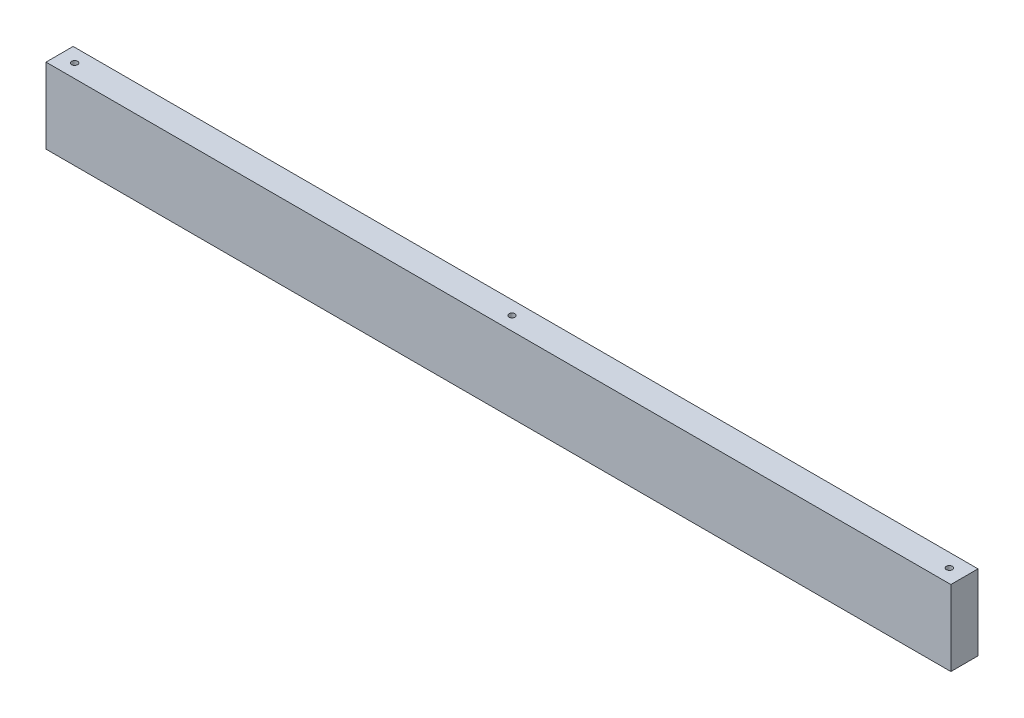
ISO-10303-21;
HEADER;
FILE_DESCRIPTION(('STEP AP214'),'2;1');
FILE_NAME('part.step','',(''),(''),'','','');
FILE_SCHEMA(('AUTOMOTIVE_DESIGN { 1 0 10303 214 1 1 1 1 }'));
ENDSEC;
DATA;
#1=APPLICATION_CONTEXT('core data for automotive mechanical design processes');
#2=APPLICATION_PROTOCOL_DEFINITION('international standard','automotive_design',2000,#1);
#3=PRODUCT_CONTEXT('',#1,'mechanical');
#4=PRODUCT('Part','Part','',(#3));
#5=PRODUCT_RELATED_PRODUCT_CATEGORY('part','',(#4));
#6=PRODUCT_DEFINITION_FORMATION('','',#4);
#7=PRODUCT_DEFINITION_CONTEXT('part definition',#1,'design');
#8=PRODUCT_DEFINITION('design','',#6,#7);
#9=PRODUCT_DEFINITION_SHAPE('','',#8);
#10=(LENGTH_UNIT() NAMED_UNIT(*) SI_UNIT(.MILLI.,.METRE.));
#11=(NAMED_UNIT(*) PLANE_ANGLE_UNIT() SI_UNIT($,.RADIAN.));
#12=(NAMED_UNIT(*) SI_UNIT($,.STERADIAN.) SOLID_ANGLE_UNIT());
#13=UNCERTAINTY_MEASURE_WITH_UNIT(LENGTH_MEASURE(1.E-05),#10,'distance_accuracy_value','');
#14=(GEOMETRIC_REPRESENTATION_CONTEXT(3) GLOBAL_UNCERTAINTY_ASSIGNED_CONTEXT((#13)) GLOBAL_UNIT_ASSIGNED_CONTEXT((#10,
#11,#12)) REPRESENTATION_CONTEXT('',''));
#15=CARTESIAN_POINT('',(0.,0.,0.));
#16=DIRECTION('',(0.,0.,1.));
#17=DIRECTION('',(1.,0.,0.));
#18=AXIS2_PLACEMENT_3D('',#15,#16,#17);
#19=CARTESIAN_POINT('',(300.,-25.,18.));
#20=DIRECTION('',(-1.,0.,0.));
#21=DIRECTION('',(0.,0.,1.));
#22=AXIS2_PLACEMENT_3D('',#19,#20,#21);
#23=PLANE('',#22);
#24=DIRECTION('',(0.,1.,0.));
#25=VECTOR('',#24,1.);
#26=CARTESIAN_POINT('',(300.,-25.,0.));
#27=LINE('',#26,#25);
#28=CARTESIAN_POINT('',(300.,-25.,0.));
#29=VERTEX_POINT('',#28);
#30=CARTESIAN_POINT('',(300.,25.,0.));
#31=VERTEX_POINT('',#30);
#32=EDGE_CURVE('E106',#29,#31,#27,.T.);
#33=ORIENTED_EDGE('',*,*,#32,.T.);
#34=DIRECTION('',(0.,0.,-1.));
#35=VECTOR('',#34,1.);
#36=CARTESIAN_POINT('',(300.,25.,18.));
#37=LINE('',#36,#35);
#38=CARTESIAN_POINT('',(300.,25.,18.));
#39=VERTEX_POINT('',#38);
#40=EDGE_CURVE('E11',#39,#31,#37,.T.);
#41=ORIENTED_EDGE('',*,*,#40,.F.);
#42=DIRECTION('',(0.,1.,0.));
#43=VECTOR('',#42,1.);
#44=CARTESIAN_POINT('',(300.,-25.,18.));
#45=LINE('',#44,#43);
#46=CARTESIAN_POINT('',(300.,-25.,18.));
#47=VERTEX_POINT('',#46);
#48=EDGE_CURVE('E94',#47,#39,#45,.T.);
#49=ORIENTED_EDGE('',*,*,#48,.F.);
#50=DIRECTION('',(0.,0.,-1.));
#51=VECTOR('',#50,1.);
#52=CARTESIAN_POINT('',(300.,-25.,18.));
#53=LINE('',#52,#51);
#54=EDGE_CURVE('E102',#47,#29,#53,.T.);
#55=ORIENTED_EDGE('',*,*,#54,.T.);
#56=EDGE_LOOP('',(#33,#41,#49,#55));
#57=FACE_BOUND('',#56,.T.);
#58=ADVANCED_FACE('F43',(#57),#23,.F.);
#59=CARTESIAN_POINT('',(-300.,25.,18.));
#60=DIRECTION('',(0.,-1.,0.));
#61=DIRECTION('',(0.,0.,-1.));
#62=AXIS2_PLACEMENT_3D('',#59,#60,#61);
#63=PLANE('',#62);
#64=CARTESIAN_POINT('',(-290.,25.,9.));
#65=DIRECTION('',(0.,1.,0.));
#66=DIRECTION('',(0.,0.,1.));
#67=AXIS2_PLACEMENT_3D('',#64,#65,#66);
#68=CIRCLE('',#67,2.);
#69=CARTESIAN_POINT('',(-290.,25.,11.));
#70=VERTEX_POINT('',#69);
#71=EDGE_CURVE('E132',#70,#70,#68,.T.);
#72=ORIENTED_EDGE('',*,*,#71,.F.);
#73=EDGE_LOOP('',(#72));
#74=FACE_BOUND('',#73,.T.);
#75=CARTESIAN_POINT('',(0.,25.,9.));
#76=DIRECTION('',(0.,1.,0.));
#77=DIRECTION('',(0.,0.,1.));
#78=AXIS2_PLACEMENT_3D('',#75,#76,#77);
#79=CIRCLE('',#78,2.);
#80=CARTESIAN_POINT('',(0.,25.,11.));
#81=VERTEX_POINT('',#80);
#82=EDGE_CURVE('E126',#81,#81,#79,.T.);
#83=ORIENTED_EDGE('',*,*,#82,.F.);
#84=EDGE_LOOP('',(#83));
#85=FACE_BOUND('',#84,.T.);
#86=CARTESIAN_POINT('',(290.,25.,9.));
#87=DIRECTION('',(0.,1.,0.));
#88=DIRECTION('',(0.,0.,1.));
#89=AXIS2_PLACEMENT_3D('',#86,#87,#88);
#90=CIRCLE('',#89,2.);
#91=CARTESIAN_POINT('',(290.,25.,11.));
#92=VERTEX_POINT('',#91);
#93=EDGE_CURVE('E120',#92,#92,#90,.T.);
#94=ORIENTED_EDGE('',*,*,#93,.F.);
#95=EDGE_LOOP('',(#94));
#96=FACE_BOUND('',#95,.T.);
#97=DIRECTION('',(-1.,0.,0.));
#98=VECTOR('',#97,1.);
#99=CARTESIAN_POINT('',(-300.,25.,0.));
#100=LINE('',#99,#98);
#101=CARTESIAN_POINT('',(-300.,25.,0.));
#102=VERTEX_POINT('',#101);
#103=EDGE_CURVE('E98',#31,#102,#100,.T.);
#104=ORIENTED_EDGE('',*,*,#103,.T.);
#105=DIRECTION('',(0.,0.,-1.));
#106=VECTOR('',#105,1.);
#107=CARTESIAN_POINT('',(-300.,25.,18.));
#108=LINE('',#107,#106);
#109=CARTESIAN_POINT('',(-300.,25.,18.));
#110=VERTEX_POINT('',#109);
#111=EDGE_CURVE('E51',#110,#102,#108,.T.);
#112=ORIENTED_EDGE('',*,*,#111,.F.);
#113=DIRECTION('',(-1.,0.,0.));
#114=VECTOR('',#113,1.);
#115=CARTESIAN_POINT('',(-300.,25.,18.));
#116=LINE('',#115,#114);
#117=EDGE_CURVE('E89',#39,#110,#116,.T.);
#118=ORIENTED_EDGE('',*,*,#117,.F.);
#119=ORIENTED_EDGE('',*,*,#40,.T.);
#120=EDGE_LOOP('',(#104,#112,#118,#119));
#121=FACE_BOUND('',#120,.T.);
#122=ADVANCED_FACE('F97',(#74,#85,#96,#121),#63,.F.);
#123=CARTESIAN_POINT('',(-300.,-25.,18.));
#124=DIRECTION('',(1.,0.,0.));
#125=DIRECTION('',(0.,0.,-1.));
#126=AXIS2_PLACEMENT_3D('',#123,#124,#125);
#127=PLANE('',#126);
#128=DIRECTION('',(0.,-1.,0.));
#129=VECTOR('',#128,1.);
#130=CARTESIAN_POINT('',(-300.,-25.,0.));
#131=LINE('',#130,#129);
#132=CARTESIAN_POINT('',(-300.,-25.,0.));
#133=VERTEX_POINT('',#132);
#134=EDGE_CURVE('E76',#102,#133,#131,.T.);
#135=ORIENTED_EDGE('',*,*,#134,.T.);
#136=DIRECTION('',(0.,0.,-1.));
#137=VECTOR('',#136,1.);
#138=CARTESIAN_POINT('',(-300.,-25.,18.));
#139=LINE('',#138,#137);
#140=CARTESIAN_POINT('',(-300.,-25.,18.));
#141=VERTEX_POINT('',#140);
#142=EDGE_CURVE('E99',#141,#133,#139,.T.);
#143=ORIENTED_EDGE('',*,*,#142,.F.);
#144=DIRECTION('',(0.,-1.,0.));
#145=VECTOR('',#144,1.);
#146=CARTESIAN_POINT('',(-300.,-25.,18.));
#147=LINE('',#146,#145);
#148=EDGE_CURVE('E92',#110,#141,#147,.T.);
#149=ORIENTED_EDGE('',*,*,#148,.F.);
#150=ORIENTED_EDGE('',*,*,#111,.T.);
#151=EDGE_LOOP('',(#135,#143,#149,#150));
#152=FACE_BOUND('',#151,.T.);
#153=ADVANCED_FACE('F100',(#152),#127,.F.);
#154=CARTESIAN_POINT('',(-300.,-25.,18.));
#155=DIRECTION('',(0.,1.,0.));
#156=DIRECTION('',(0.,0.,1.));
#157=AXIS2_PLACEMENT_3D('',#154,#155,#156);
#158=PLANE('',#157);
#159=DIRECTION('',(1.,0.,0.));
#160=VECTOR('',#159,1.);
#161=CARTESIAN_POINT('',(-300.,-25.,0.));
#162=LINE('',#161,#160);
#163=EDGE_CURVE('E82',#133,#29,#162,.T.);
#164=ORIENTED_EDGE('',*,*,#163,.T.);
#165=ORIENTED_EDGE('',*,*,#54,.F.);
#166=DIRECTION('',(1.,0.,0.));
#167=VECTOR('',#166,1.);
#168=CARTESIAN_POINT('',(-300.,-25.,18.));
#169=LINE('',#168,#167);
#170=EDGE_CURVE('E59',#141,#47,#169,.T.);
#171=ORIENTED_EDGE('',*,*,#170,.F.);
#172=ORIENTED_EDGE('',*,*,#142,.T.);
#173=EDGE_LOOP('',(#164,#165,#171,#172));
#174=FACE_BOUND('',#173,.T.);
#175=ADVANCED_FACE('F114',(#174),#158,.F.);
#176=CARTESIAN_POINT('',(0.,0.,18.));
#177=DIRECTION('',(0.,0.,-1.));
#178=DIRECTION('',(-1.,0.,0.));
#179=AXIS2_PLACEMENT_3D('',#176,#177,#178);
#180=PLANE('',#179);
#181=ORIENTED_EDGE('',*,*,#48,.T.);
#182=ORIENTED_EDGE('',*,*,#117,.T.);
#183=ORIENTED_EDGE('',*,*,#148,.T.);
#184=ORIENTED_EDGE('',*,*,#170,.T.);
#185=EDGE_LOOP('',(#181,#182,#183,#184));
#186=FACE_BOUND('',#185,.T.);
#187=ADVANCED_FACE('F90',(#186),#180,.F.);
#188=CARTESIAN_POINT('',(0.,0.,0.));
#189=DIRECTION('',(0.,0.,-1.));
#190=DIRECTION('',(-1.,0.,0.));
#191=AXIS2_PLACEMENT_3D('',#188,#189,#190);
#192=PLANE('',#191);
#193=ORIENTED_EDGE('',*,*,#32,.F.);
#194=ORIENTED_EDGE('',*,*,#163,.F.);
#195=ORIENTED_EDGE('',*,*,#134,.F.);
#196=ORIENTED_EDGE('',*,*,#103,.F.);
#197=EDGE_LOOP('',(#193,#194,#195,#196));
#198=FACE_BOUND('',#197,.T.);
#199=ADVANCED_FACE('F117',(#198),#192,.T.);
#200=CARTESIAN_POINT('',(290.,0.,9.));
#201=DIRECTION('',(0.,1.,0.));
#202=DIRECTION('',(0.,0.,1.));
#203=AXIS2_PLACEMENT_3D('',#200,#201,#202);
#204=CYLINDRICAL_SURFACE('',#203,2.);
#205=CARTESIAN_POINT('',(290.,0.,9.));
#206=DIRECTION('',(0.,1.,0.));
#207=DIRECTION('',(0.,0.,1.));
#208=AXIS2_PLACEMENT_3D('',#205,#206,#207);
#209=CIRCLE('',#208,2.);
#210=CARTESIAN_POINT('',(290.,0.,11.));
#211=VERTEX_POINT('',#210);
#212=EDGE_CURVE('E123',#211,#211,#209,.T.);
#213=ORIENTED_EDGE('',*,*,#212,.F.);
#214=EDGE_LOOP('',(#213));
#215=FACE_BOUND('',#214,.T.);
#216=ORIENTED_EDGE('',*,*,#93,.T.);
#217=EDGE_LOOP('',(#216));
#218=FACE_BOUND('',#217,.T.);
#219=ADVANCED_FACE('F153',(#215,#218),#204,.F.);
#220=CARTESIAN_POINT('',(290.,0.,9.));
#221=DIRECTION('',(0.,1.,0.));
#222=DIRECTION('',(0.,0.,1.));
#223=AXIS2_PLACEMENT_3D('',#220,#221,#222);
#224=PLANE('',#223);
#225=ORIENTED_EDGE('',*,*,#212,.T.);
#226=EDGE_LOOP('',(#225));
#227=FACE_BOUND('',#226,.T.);
#228=ADVANCED_FACE('F155',(#227),#224,.T.);
#229=CARTESIAN_POINT('',(0.,0.,9.));
#230=DIRECTION('',(0.,1.,0.));
#231=DIRECTION('',(0.,0.,1.));
#232=AXIS2_PLACEMENT_3D('',#229,#230,#231);
#233=CYLINDRICAL_SURFACE('',#232,2.);
#234=CARTESIAN_POINT('',(0.,0.,9.));
#235=DIRECTION('',(0.,1.,0.));
#236=DIRECTION('',(0.,0.,1.));
#237=AXIS2_PLACEMENT_3D('',#234,#235,#236);
#238=CIRCLE('',#237,2.);
#239=CARTESIAN_POINT('',(0.,0.,11.));
#240=VERTEX_POINT('',#239);
#241=EDGE_CURVE('E129',#240,#240,#238,.T.);
#242=ORIENTED_EDGE('',*,*,#241,.F.);
#243=EDGE_LOOP('',(#242));
#244=FACE_BOUND('',#243,.T.);
#245=ORIENTED_EDGE('',*,*,#82,.T.);
#246=EDGE_LOOP('',(#245));
#247=FACE_BOUND('',#246,.T.);
#248=ADVANCED_FACE('F161',(#244,#247),#233,.F.);
#249=CARTESIAN_POINT('',(0.,0.,9.));
#250=DIRECTION('',(0.,1.,0.));
#251=DIRECTION('',(0.,0.,1.));
#252=AXIS2_PLACEMENT_3D('',#249,#250,#251);
#253=PLANE('',#252);
#254=ORIENTED_EDGE('',*,*,#241,.T.);
#255=EDGE_LOOP('',(#254));
#256=FACE_BOUND('',#255,.T.);
#257=ADVANCED_FACE('F143',(#256),#253,.T.);
#258=CARTESIAN_POINT('',(-290.,0.,9.));
#259=DIRECTION('',(0.,1.,0.));
#260=DIRECTION('',(0.,0.,1.));
#261=AXIS2_PLACEMENT_3D('',#258,#259,#260);
#262=CYLINDRICAL_SURFACE('',#261,2.);
#263=CARTESIAN_POINT('',(-290.,0.,9.));
#264=DIRECTION('',(0.,1.,0.));
#265=DIRECTION('',(0.,0.,1.));
#266=AXIS2_PLACEMENT_3D('',#263,#264,#265);
#267=CIRCLE('',#266,2.);
#268=CARTESIAN_POINT('',(-290.,0.,11.));
#269=VERTEX_POINT('',#268);
#270=EDGE_CURVE('E109',#269,#269,#267,.T.);
#271=ORIENTED_EDGE('',*,*,#270,.F.);
#272=EDGE_LOOP('',(#271));
#273=FACE_BOUND('',#272,.T.);
#274=ORIENTED_EDGE('',*,*,#71,.T.);
#275=EDGE_LOOP('',(#274));
#276=FACE_BOUND('',#275,.T.);
#277=ADVANCED_FACE('F140',(#273,#276),#262,.F.);
#278=CARTESIAN_POINT('',(-290.,0.,9.));
#279=DIRECTION('',(0.,1.,0.));
#280=DIRECTION('',(0.,0.,1.));
#281=AXIS2_PLACEMENT_3D('',#278,#279,#280);
#282=PLANE('',#281);
#283=ORIENTED_EDGE('',*,*,#270,.T.);
#284=EDGE_LOOP('',(#283));
#285=FACE_BOUND('',#284,.T.);
#286=ADVANCED_FACE('F138',(#285),#282,.T.);
#287=CLOSED_SHELL('',(#58,#122,#153,#175,#187,#199,#219,#228,#248,#257,#277,#286));
#288=MANIFOLD_SOLID_BREP('B2',#287);
#289=ADVANCED_BREP_SHAPE_REPRESENTATION('',(#18,#288),#14);
#290=SHAPE_DEFINITION_REPRESENTATION(#9,#289);
ENDSEC;
END-ISO-10303-21;
